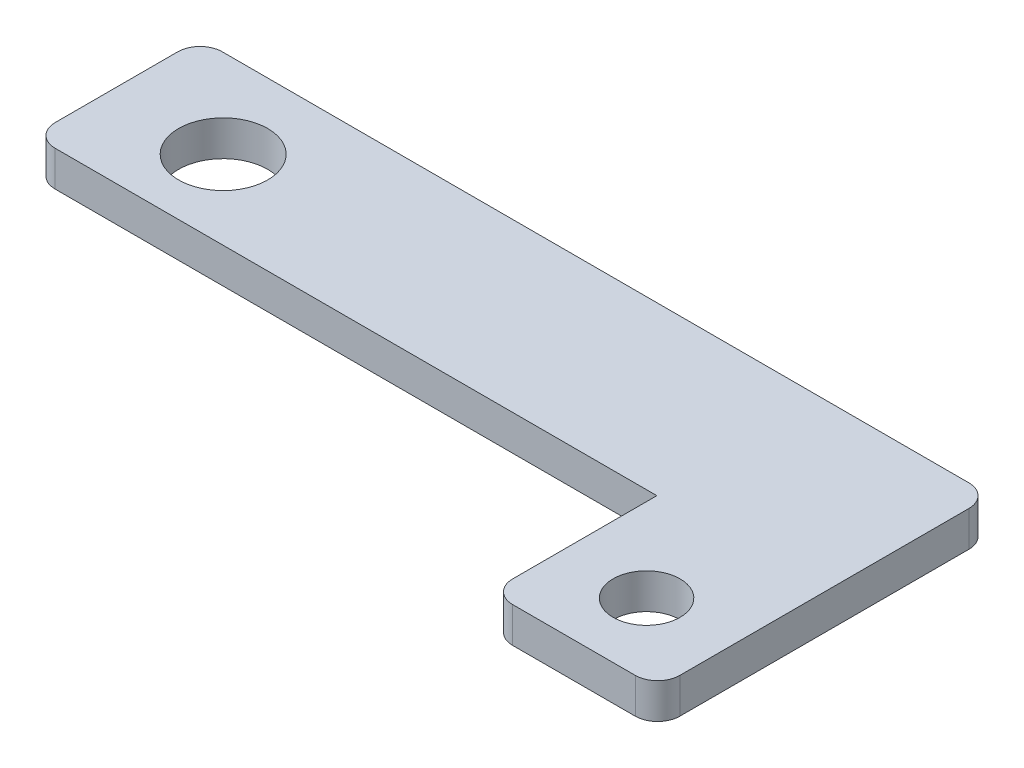
ISO-10303-21;
HEADER;
FILE_DESCRIPTION(('STEP AP214'),'2;1');
FILE_NAME('part.step','',(''),(''),'','','');
FILE_SCHEMA(('AUTOMOTIVE_DESIGN { 1 0 10303 214 1 1 1 1 }'));
ENDSEC;
DATA;
#1=APPLICATION_CONTEXT('core data for automotive mechanical design processes');
#2=APPLICATION_PROTOCOL_DEFINITION('international standard','automotive_design',2000,#1);
#3=PRODUCT_CONTEXT('',#1,'mechanical');
#4=PRODUCT('Part','Part','',(#3));
#5=PRODUCT_RELATED_PRODUCT_CATEGORY('part','',(#4));
#6=PRODUCT_DEFINITION_FORMATION('','',#4);
#7=PRODUCT_DEFINITION_CONTEXT('part definition',#1,'design');
#8=PRODUCT_DEFINITION('design','',#6,#7);
#9=PRODUCT_DEFINITION_SHAPE('','',#8);
#10=(LENGTH_UNIT() NAMED_UNIT(*) SI_UNIT(.MILLI.,.METRE.));
#11=(NAMED_UNIT(*) PLANE_ANGLE_UNIT() SI_UNIT($,.RADIAN.));
#12=(NAMED_UNIT(*) SI_UNIT($,.STERADIAN.) SOLID_ANGLE_UNIT());
#13=UNCERTAINTY_MEASURE_WITH_UNIT(LENGTH_MEASURE(1.E-05),#10,'distance_accuracy_value','');
#14=(GEOMETRIC_REPRESENTATION_CONTEXT(3) GLOBAL_UNCERTAINTY_ASSIGNED_CONTEXT((#13)) GLOBAL_UNIT_ASSIGNED_CONTEXT((#10,
#11,#12)) REPRESENTATION_CONTEXT('',''));
#15=CARTESIAN_POINT('',(0.,0.,0.));
#16=DIRECTION('',(0.,0.,1.));
#17=DIRECTION('',(1.,0.,0.));
#18=AXIS2_PLACEMENT_3D('',#15,#16,#17);
#19=CARTESIAN_POINT('',(0.,44.6697171240975,0.));
#20=DIRECTION('',(0.,-1.,0.));
#21=DIRECTION('',(0.,0.,-1.));
#22=AXIS2_PLACEMENT_3D('',#19,#20,#21);
#23=PLANE('',#22);
#24=CARTESIAN_POINT('',(147.087093798444,44.6697171240975,-59.2577881890432));
#25=DIRECTION('',(0.,-1.,0.));
#26=DIRECTION('',(0.,0.,-1.));
#27=AXIS2_PLACEMENT_3D('',#24,#25,#26);
#28=CIRCLE('',#27,3.99999999999999);
#29=CARTESIAN_POINT('',(147.087093798444,44.6697171240975,-63.2577881890432));
#30=VERTEX_POINT('',#29);
#31=EDGE_CURVE('E170',#30,#30,#28,.T.);
#32=ORIENTED_EDGE('',*,*,#31,.F.);
#33=EDGE_LOOP('',(#32));
#34=FACE_BOUND('',#33,.T.);
#35=DIRECTION('',(-1.,0.,0.));
#36=VECTOR('',#35,1.);
#37=CARTESIAN_POINT('',(208.087093798444,44.6697171240975,-37.2440842596447));
#38=LINE('',#37,#36);
#39=CARTESIAN_POINT('',(206.087093798444,44.6697171240975,-37.2440842596447));
#40=VERTEX_POINT('',#39);
#41=CARTESIAN_POINT('',(195.087093798444,44.6697171240975,-37.2440842596447));
#42=VERTEX_POINT('',#41);
#43=EDGE_CURVE('E139',#40,#42,#38,.T.);
#44=ORIENTED_EDGE('',*,*,#43,.T.);
#45=CARTESIAN_POINT('',(195.087093798444,44.6697171240975,-39.2440842596448));
#46=DIRECTION('',(0.,-1.,0.));
#47=DIRECTION('',(0.,0.,-1.));
#48=AXIS2_PLACEMENT_3D('',#45,#46,#47);
#49=CIRCLE('',#48,2.);
#50=CARTESIAN_POINT('',(193.087093798444,44.6697171240975,-39.2440842596448));
#51=VERTEX_POINT('',#50);
#52=EDGE_CURVE('E134',#42,#51,#49,.T.);
#53=ORIENTED_EDGE('',*,*,#52,.T.);
#54=DIRECTION('',(0.,0.,-1.));
#55=VECTOR('',#54,1.);
#56=CARTESIAN_POINT('',(193.087093798444,44.6697171240975,-52.180672920051));
#57=LINE('',#56,#55);
#58=CARTESIAN_POINT('',(193.087093798444,44.6697171240975,-52.180672920051));
#59=VERTEX_POINT('',#58);
#60=EDGE_CURVE('E126',#51,#59,#57,.T.);
#61=ORIENTED_EDGE('',*,*,#60,.T.);
#62=DIRECTION('',(-1.,0.,0.));
#63=VECTOR('',#62,1.);
#64=CARTESIAN_POINT('',(137.087093798444,44.6697171240975,-52.180672920051));
#65=LINE('',#64,#63);
#66=CARTESIAN_POINT('',(139.087093798444,44.6697171240975,-52.180672920051));
#67=VERTEX_POINT('',#66);
#68=EDGE_CURVE('E131',#59,#67,#65,.T.);
#69=ORIENTED_EDGE('',*,*,#68,.T.);
#70=CARTESIAN_POINT('',(139.087093798444,44.6697171240975,-54.180672920051));
#71=DIRECTION('',(0.,-1.,0.));
#72=DIRECTION('',(0.,0.,-1.));
#73=AXIS2_PLACEMENT_3D('',#70,#71,#72);
#74=CIRCLE('',#73,2.);
#75=CARTESIAN_POINT('',(137.087093798444,44.6697171240975,-54.180672920051));
#76=VERTEX_POINT('',#75);
#77=EDGE_CURVE('E196',#67,#76,#74,.T.);
#78=ORIENTED_EDGE('',*,*,#77,.T.);
#79=DIRECTION('',(0.,0.,-1.));
#80=VECTOR('',#79,1.);
#81=CARTESIAN_POINT('',(137.087093798444,44.6697171240975,-67.180672920051));
#82=LINE('',#81,#80);
#83=CARTESIAN_POINT('',(137.087093798444,44.6697171240975,-65.180672920051));
#84=VERTEX_POINT('',#83);
#85=EDGE_CURVE('E152',#76,#84,#82,.T.);
#86=ORIENTED_EDGE('',*,*,#85,.T.);
#87=CARTESIAN_POINT('',(139.087093798444,44.6697171240975,-65.180672920051));
#88=DIRECTION('',(0.,-1.,0.));
#89=DIRECTION('',(0.,0.,-1.));
#90=AXIS2_PLACEMENT_3D('',#87,#88,#89);
#91=CIRCLE('',#90,2.);
#92=CARTESIAN_POINT('',(139.087093798444,44.6697171240975,-67.180672920051));
#93=VERTEX_POINT('',#92);
#94=EDGE_CURVE('E201',#84,#93,#91,.T.);
#95=ORIENTED_EDGE('',*,*,#94,.T.);
#96=DIRECTION('',(1.,0.,0.));
#97=VECTOR('',#96,1.);
#98=CARTESIAN_POINT('',(137.087093798444,44.6697171240975,-67.180672920051));
#99=LINE('',#98,#97);
#100=CARTESIAN_POINT('',(206.087093798444,44.6697171240975,-67.180672920051));
#101=VERTEX_POINT('',#100);
#102=EDGE_CURVE('E155',#93,#101,#99,.T.);
#103=ORIENTED_EDGE('',*,*,#102,.T.);
#104=CARTESIAN_POINT('',(206.087093798444,44.6697171240975,-65.180672920051));
#105=DIRECTION('',(0.,-1.,0.));
#106=DIRECTION('',(0.,0.,-1.));
#107=AXIS2_PLACEMENT_3D('',#104,#105,#106);
#108=CIRCLE('',#107,2.);
#109=CARTESIAN_POINT('',(208.087093798444,44.6697171240975,-65.180672920051));
#110=VERTEX_POINT('',#109);
#111=EDGE_CURVE('E65',#101,#110,#108,.T.);
#112=ORIENTED_EDGE('',*,*,#111,.T.);
#113=DIRECTION('',(0.,0.,1.));
#114=VECTOR('',#113,1.);
#115=CARTESIAN_POINT('',(208.087093798444,44.6697171240975,-67.180672920051));
#116=LINE('',#115,#114);
#117=CARTESIAN_POINT('',(208.087093798444,44.6697171240975,-39.2440842596447));
#118=VERTEX_POINT('',#117);
#119=EDGE_CURVE('E164',#110,#118,#116,.T.);
#120=ORIENTED_EDGE('',*,*,#119,.T.);
#121=CARTESIAN_POINT('',(206.087093798444,44.6697171240975,-39.2440842596447));
#122=DIRECTION('',(0.,-1.,0.));
#123=DIRECTION('',(0.,0.,-1.));
#124=AXIS2_PLACEMENT_3D('',#121,#122,#123);
#125=CIRCLE('',#124,2.);
#126=EDGE_CURVE('E198',#118,#40,#125,.T.);
#127=ORIENTED_EDGE('',*,*,#126,.T.);
#128=EDGE_LOOP('',(#44,#53,#61,#69,#78,#86,#95,#103,#112,#120,#127));
#129=FACE_BOUND('',#128,.T.);
#130=CARTESIAN_POINT('',(200.587093798444,44.6697171240975,-43.7577881890431));
#131=DIRECTION('',(0.,-1.,0.));
#132=DIRECTION('',(0.,0.,-1.));
#133=AXIS2_PLACEMENT_3D('',#130,#131,#132);
#134=CIRCLE('',#133,2.99999999999999);
#135=CARTESIAN_POINT('',(200.587093798444,44.6697171240975,-46.7577881890431));
#136=VERTEX_POINT('',#135);
#137=EDGE_CURVE('E294',#136,#136,#134,.T.);
#138=ORIENTED_EDGE('',*,*,#137,.F.);
#139=EDGE_LOOP('',(#138));
#140=FACE_BOUND('',#139,.T.);
#141=ADVANCED_FACE('F43',(#34,#129,#140),#23,.T.);
#142=CARTESIAN_POINT('',(0.,47.8447171240974,0.));
#143=DIRECTION('',(0.,-1.,0.));
#144=DIRECTION('',(0.,0.,-1.));
#145=AXIS2_PLACEMENT_3D('',#142,#143,#144);
#146=PLANE('',#145);
#147=DIRECTION('',(0.,0.,-1.));
#148=VECTOR('',#147,1.);
#149=CARTESIAN_POINT('',(193.087093798444,47.8447171240974,-52.180672920051));
#150=LINE('',#149,#148);
#151=CARTESIAN_POINT('',(193.087093798444,47.8447171240974,-39.2440842596448));
#152=VERTEX_POINT('',#151);
#153=CARTESIAN_POINT('',(193.087093798444,47.8447171240974,-52.180672920051));
#154=VERTEX_POINT('',#153);
#155=EDGE_CURVE('E144',#152,#154,#150,.T.);
#156=ORIENTED_EDGE('',*,*,#155,.F.);
#157=CARTESIAN_POINT('',(195.087093798444,47.8447171240974,-39.2440842596448));
#158=DIRECTION('',(0.,-1.,0.));
#159=DIRECTION('',(0.,0.,-1.));
#160=AXIS2_PLACEMENT_3D('',#157,#158,#159);
#161=CIRCLE('',#160,2.);
#162=CARTESIAN_POINT('',(195.087093798444,47.8447171240974,-37.2440842596447));
#163=VERTEX_POINT('',#162);
#164=EDGE_CURVE('E189',#152,#163,#161,.F.);
#165=ORIENTED_EDGE('',*,*,#164,.T.);
#166=DIRECTION('',(-1.,0.,0.));
#167=VECTOR('',#166,1.);
#168=CARTESIAN_POINT('',(208.087093798444,47.8447171240974,-37.2440842596447));
#169=LINE('',#168,#167);
#170=CARTESIAN_POINT('',(206.087093798444,47.8447171240974,-37.2440842596447));
#171=VERTEX_POINT('',#170);
#172=EDGE_CURVE('E157',#171,#163,#169,.T.);
#173=ORIENTED_EDGE('',*,*,#172,.F.);
#174=CARTESIAN_POINT('',(206.087093798444,47.8447171240974,-39.2440842596447));
#175=DIRECTION('',(0.,-1.,0.));
#176=DIRECTION('',(0.,0.,-1.));
#177=AXIS2_PLACEMENT_3D('',#174,#175,#176);
#178=CIRCLE('',#177,2.);
#179=CARTESIAN_POINT('',(208.087093798444,47.8447171240974,-39.2440842596447));
#180=VERTEX_POINT('',#179);
#181=EDGE_CURVE('E183',#171,#180,#178,.F.);
#182=ORIENTED_EDGE('',*,*,#181,.T.);
#183=DIRECTION('',(0.,0.,1.));
#184=VECTOR('',#183,1.);
#185=CARTESIAN_POINT('',(208.087093798444,47.8447171240974,-67.180672920051));
#186=LINE('',#185,#184);
#187=CARTESIAN_POINT('',(208.087093798444,47.8447171240974,-65.180672920051));
#188=VERTEX_POINT('',#187);
#189=EDGE_CURVE('E176',#188,#180,#186,.T.);
#190=ORIENTED_EDGE('',*,*,#189,.F.);
#191=CARTESIAN_POINT('',(206.087093798444,47.8447171240974,-65.180672920051));
#192=DIRECTION('',(0.,-1.,0.));
#193=DIRECTION('',(0.,0.,-1.));
#194=AXIS2_PLACEMENT_3D('',#191,#192,#193);
#195=CIRCLE('',#194,2.);
#196=CARTESIAN_POINT('',(206.087093798444,47.8447171240974,-67.180672920051));
#197=VERTEX_POINT('',#196);
#198=EDGE_CURVE('E185',#188,#197,#195,.F.);
#199=ORIENTED_EDGE('',*,*,#198,.T.);
#200=DIRECTION('',(1.,0.,0.));
#201=VECTOR('',#200,1.);
#202=CARTESIAN_POINT('',(137.087093798444,47.8447171240974,-67.180672920051));
#203=LINE('',#202,#201);
#204=CARTESIAN_POINT('',(139.087093798444,47.8447171240974,-67.180672920051));
#205=VERTEX_POINT('',#204);
#206=EDGE_CURVE('E173',#205,#197,#203,.T.);
#207=ORIENTED_EDGE('',*,*,#206,.F.);
#208=CARTESIAN_POINT('',(139.087093798444,47.8447171240974,-65.180672920051));
#209=DIRECTION('',(0.,-1.,0.));
#210=DIRECTION('',(0.,0.,-1.));
#211=AXIS2_PLACEMENT_3D('',#208,#209,#210);
#212=CIRCLE('',#211,2.);
#213=CARTESIAN_POINT('',(137.087093798444,47.8447171240974,-65.180672920051));
#214=VERTEX_POINT('',#213);
#215=EDGE_CURVE('E187',#205,#214,#212,.F.);
#216=ORIENTED_EDGE('',*,*,#215,.T.);
#217=DIRECTION('',(0.,0.,-1.));
#218=VECTOR('',#217,1.);
#219=CARTESIAN_POINT('',(137.087093798444,47.8447171240974,-67.180672920051));
#220=LINE('',#219,#218);
#221=CARTESIAN_POINT('',(137.087093798444,47.8447171240974,-54.180672920051));
#222=VERTEX_POINT('',#221);
#223=EDGE_CURVE('E169',#222,#214,#220,.T.);
#224=ORIENTED_EDGE('',*,*,#223,.F.);
#225=CARTESIAN_POINT('',(139.087093798444,47.8447171240974,-54.180672920051));
#226=DIRECTION('',(0.,-1.,0.));
#227=DIRECTION('',(0.,0.,-1.));
#228=AXIS2_PLACEMENT_3D('',#225,#226,#227);
#229=CIRCLE('',#228,2.);
#230=CARTESIAN_POINT('',(139.087093798444,47.8447171240974,-52.180672920051));
#231=VERTEX_POINT('',#230);
#232=EDGE_CURVE('E181',#222,#231,#229,.F.);
#233=ORIENTED_EDGE('',*,*,#232,.T.);
#234=DIRECTION('',(-1.,0.,0.));
#235=VECTOR('',#234,1.);
#236=CARTESIAN_POINT('',(137.087093798444,47.8447171240974,-52.180672920051));
#237=LINE('',#236,#235);
#238=EDGE_CURVE('E167',#154,#231,#237,.T.);
#239=ORIENTED_EDGE('',*,*,#238,.F.);
#240=EDGE_LOOP('',(#156,#165,#173,#182,#190,#199,#207,#216,#224,#233,#239));
#241=FACE_BOUND('',#240,.T.);
#242=CARTESIAN_POINT('',(147.087093798444,47.8447171240974,-59.2577881890432));
#243=DIRECTION('',(0.,-1.,0.));
#244=DIRECTION('',(0.,0.,-1.));
#245=AXIS2_PLACEMENT_3D('',#242,#243,#244);
#246=CIRCLE('',#245,3.99999999999999);
#247=CARTESIAN_POINT('',(147.087093798444,47.8447171240974,-63.2577881890432));
#248=VERTEX_POINT('',#247);
#249=EDGE_CURVE('E160',#248,#248,#246,.T.);
#250=ORIENTED_EDGE('',*,*,#249,.T.);
#251=EDGE_LOOP('',(#250));
#252=FACE_BOUND('',#251,.T.);
#253=CARTESIAN_POINT('',(200.587093798444,47.8447171240974,-43.7577881890431));
#254=DIRECTION('',(0.,-1.,0.));
#255=DIRECTION('',(0.,0.,-1.));
#256=AXIS2_PLACEMENT_3D('',#253,#254,#255);
#257=CIRCLE('',#256,2.99999999999999);
#258=CARTESIAN_POINT('',(200.587093798444,47.8447171240974,-46.7577881890431));
#259=VERTEX_POINT('',#258);
#260=EDGE_CURVE('E297',#259,#259,#257,.T.);
#261=ORIENTED_EDGE('',*,*,#260,.T.);
#262=EDGE_LOOP('',(#261));
#263=FACE_BOUND('',#262,.T.);
#264=ADVANCED_FACE('F220',(#241,#252,#263),#146,.F.);
#265=CARTESIAN_POINT('',(137.087093798444,44.6697171240975,-52.180672920051));
#266=DIRECTION('',(0.,0.,-1.));
#267=DIRECTION('',(-1.,0.,0.));
#268=AXIS2_PLACEMENT_3D('',#265,#266,#267);
#269=PLANE('',#268);
#270=ORIENTED_EDGE('',*,*,#238,.T.);
#271=DIRECTION('',(0.,1.,0.));
#272=VECTOR('',#271,1.);
#273=CARTESIAN_POINT('',(139.087093798444,44.6697171240975,-52.180672920051));
#274=LINE('',#273,#272);
#275=EDGE_CURVE('E11',#231,#67,#274,.F.);
#276=ORIENTED_EDGE('',*,*,#275,.T.);
#277=ORIENTED_EDGE('',*,*,#68,.F.);
#278=DIRECTION('',(0.,1.,0.));
#279=VECTOR('',#278,1.);
#280=CARTESIAN_POINT('',(193.087093798444,44.6697171240975,-52.180672920051));
#281=LINE('',#280,#279);
#282=EDGE_CURVE('E138',#59,#154,#281,.T.);
#283=ORIENTED_EDGE('',*,*,#282,.T.);
#284=EDGE_LOOP('',(#270,#276,#277,#283));
#285=FACE_BOUND('',#284,.T.);
#286=ADVANCED_FACE('F150',(#285),#269,.F.);
#287=CARTESIAN_POINT('',(137.087093798444,44.6697171240975,-67.180672920051));
#288=DIRECTION('',(1.,0.,0.));
#289=DIRECTION('',(0.,0.,-1.));
#290=AXIS2_PLACEMENT_3D('',#287,#288,#289);
#291=PLANE('',#290);
#292=ORIENTED_EDGE('',*,*,#223,.T.);
#293=DIRECTION('',(0.,1.,0.));
#294=VECTOR('',#293,1.);
#295=CARTESIAN_POINT('',(137.087093798444,44.6697171240975,-65.180672920051));
#296=LINE('',#295,#294);
#297=EDGE_CURVE('E212',#214,#84,#296,.F.);
#298=ORIENTED_EDGE('',*,*,#297,.T.);
#299=ORIENTED_EDGE('',*,*,#85,.F.);
#300=DIRECTION('',(0.,1.,0.));
#301=VECTOR('',#300,1.);
#302=CARTESIAN_POINT('',(137.087093798444,44.6697171240975,-54.180672920051));
#303=LINE('',#302,#301);
#304=EDGE_CURVE('E209',#76,#222,#303,.T.);
#305=ORIENTED_EDGE('',*,*,#304,.T.);
#306=EDGE_LOOP('',(#292,#298,#299,#305));
#307=FACE_BOUND('',#306,.T.);
#308=ADVANCED_FACE('F240',(#307),#291,.F.);
#309=CARTESIAN_POINT('',(137.087093798444,44.6697171240975,-67.180672920051));
#310=DIRECTION('',(0.,0.,1.));
#311=DIRECTION('',(1.,0.,0.));
#312=AXIS2_PLACEMENT_3D('',#309,#310,#311);
#313=PLANE('',#312);
#314=ORIENTED_EDGE('',*,*,#102,.F.);
#315=DIRECTION('',(0.,1.,0.));
#316=VECTOR('',#315,1.);
#317=CARTESIAN_POINT('',(139.087093798444,44.6697171240975,-67.180672920051));
#318=LINE('',#317,#316);
#319=EDGE_CURVE('E206',#93,#205,#318,.T.);
#320=ORIENTED_EDGE('',*,*,#319,.T.);
#321=ORIENTED_EDGE('',*,*,#206,.T.);
#322=DIRECTION('',(0.,1.,0.));
#323=VECTOR('',#322,1.);
#324=CARTESIAN_POINT('',(206.087093798444,44.6697171240975,-67.180672920051));
#325=LINE('',#324,#323);
#326=EDGE_CURVE('E204',#197,#101,#325,.F.);
#327=ORIENTED_EDGE('',*,*,#326,.T.);
#328=EDGE_LOOP('',(#314,#320,#321,#327));
#329=FACE_BOUND('',#328,.T.);
#330=ADVANCED_FACE('F247',(#329),#313,.F.);
#331=CARTESIAN_POINT('',(208.087093798444,44.6697171240975,-67.180672920051));
#332=DIRECTION('',(-1.,0.,0.));
#333=DIRECTION('',(0.,0.,1.));
#334=AXIS2_PLACEMENT_3D('',#331,#332,#333);
#335=PLANE('',#334);
#336=ORIENTED_EDGE('',*,*,#119,.F.);
#337=DIRECTION('',(0.,1.,0.));
#338=VECTOR('',#337,1.);
#339=CARTESIAN_POINT('',(208.087093798444,44.6697171240975,-65.180672920051));
#340=LINE('',#339,#338);
#341=EDGE_CURVE('E51',#110,#188,#340,.T.);
#342=ORIENTED_EDGE('',*,*,#341,.T.);
#343=ORIENTED_EDGE('',*,*,#189,.T.);
#344=DIRECTION('',(0.,1.,0.));
#345=VECTOR('',#344,1.);
#346=CARTESIAN_POINT('',(208.087093798444,44.6697171240975,-39.2440842596447));
#347=LINE('',#346,#345);
#348=EDGE_CURVE('E58',#180,#118,#347,.F.);
#349=ORIENTED_EDGE('',*,*,#348,.T.);
#350=EDGE_LOOP('',(#336,#342,#343,#349));
#351=FACE_BOUND('',#350,.T.);
#352=ADVANCED_FACE('F217',(#351),#335,.F.);
#353=CARTESIAN_POINT('',(208.087093798444,44.6697171240975,-37.2440842596447));
#354=DIRECTION('',(0.,0.,-1.));
#355=DIRECTION('',(-1.,0.,0.));
#356=AXIS2_PLACEMENT_3D('',#353,#354,#355);
#357=PLANE('',#356);
#358=ORIENTED_EDGE('',*,*,#172,.T.);
#359=DIRECTION('',(0.,1.,0.));
#360=VECTOR('',#359,1.);
#361=CARTESIAN_POINT('',(195.087093798444,44.6697171240975,-37.2440842596447));
#362=LINE('',#361,#360);
#363=EDGE_CURVE('E194',#163,#42,#362,.F.);
#364=ORIENTED_EDGE('',*,*,#363,.T.);
#365=ORIENTED_EDGE('',*,*,#43,.F.);
#366=DIRECTION('',(0.,1.,0.));
#367=VECTOR('',#366,1.);
#368=CARTESIAN_POINT('',(206.087093798444,44.6697171240975,-37.2440842596447));
#369=LINE('',#368,#367);
#370=EDGE_CURVE('E191',#40,#171,#369,.T.);
#371=ORIENTED_EDGE('',*,*,#370,.T.);
#372=EDGE_LOOP('',(#358,#364,#365,#371));
#373=FACE_BOUND('',#372,.T.);
#374=ADVANCED_FACE('F230',(#373),#357,.F.);
#375=CARTESIAN_POINT('',(193.087093798444,44.6697171240975,-52.180672920051));
#376=DIRECTION('',(1.,0.,0.));
#377=DIRECTION('',(0.,0.,-1.));
#378=AXIS2_PLACEMENT_3D('',#375,#376,#377);
#379=PLANE('',#378);
#380=ORIENTED_EDGE('',*,*,#60,.F.);
#381=DIRECTION('',(0.,1.,0.));
#382=VECTOR('',#381,1.);
#383=CARTESIAN_POINT('',(193.087093798444,44.6697171240975,-39.2440842596448));
#384=LINE('',#383,#382);
#385=EDGE_CURVE('E148',#51,#152,#384,.T.);
#386=ORIENTED_EDGE('',*,*,#385,.T.);
#387=ORIENTED_EDGE('',*,*,#155,.T.);
#388=ORIENTED_EDGE('',*,*,#282,.F.);
#389=EDGE_LOOP('',(#380,#386,#387,#388));
#390=FACE_BOUND('',#389,.T.);
#391=ADVANCED_FACE('F142',(#390),#379,.F.);
#392=CARTESIAN_POINT('',(147.087093798444,44.6697171240975,-59.2577881890432));
#393=DIRECTION('',(0.,1.,0.));
#394=DIRECTION('',(0.,0.,1.));
#395=AXIS2_PLACEMENT_3D('',#392,#393,#394);
#396=CYLINDRICAL_SURFACE('',#395,3.99999999999999);
#397=ORIENTED_EDGE('',*,*,#31,.T.);
#398=EDGE_LOOP('',(#397));
#399=FACE_BOUND('',#398,.T.);
#400=ORIENTED_EDGE('',*,*,#249,.F.);
#401=EDGE_LOOP('',(#400));
#402=FACE_BOUND('',#401,.T.);
#403=ADVANCED_FACE('F267',(#399,#402),#396,.F.);
#404=CARTESIAN_POINT('',(200.587093798444,44.6697171240975,-43.7577881890431));
#405=DIRECTION('',(0.,1.,0.));
#406=DIRECTION('',(0.,0.,1.));
#407=AXIS2_PLACEMENT_3D('',#404,#405,#406);
#408=CYLINDRICAL_SURFACE('',#407,2.99999999999999);
#409=ORIENTED_EDGE('',*,*,#137,.T.);
#410=EDGE_LOOP('',(#409));
#411=FACE_BOUND('',#410,.T.);
#412=ORIENTED_EDGE('',*,*,#260,.F.);
#413=EDGE_LOOP('',(#412));
#414=FACE_BOUND('',#413,.T.);
#415=ADVANCED_FACE('F283',(#411,#414),#408,.F.);
#416=CARTESIAN_POINT('',(195.087093798444,44.6697171240975,-39.2440842596448));
#417=DIRECTION('',(0.,1.,0.));
#418=DIRECTION('',(0.,0.,1.));
#419=AXIS2_PLACEMENT_3D('',#416,#417,#418);
#420=CYLINDRICAL_SURFACE('',#419,2.);
#421=ORIENTED_EDGE('',*,*,#52,.F.);
#422=ORIENTED_EDGE('',*,*,#363,.F.);
#423=ORIENTED_EDGE('',*,*,#164,.F.);
#424=ORIENTED_EDGE('',*,*,#385,.F.);
#425=EDGE_LOOP('',(#421,#422,#423,#424));
#426=FACE_BOUND('',#425,.T.);
#427=ADVANCED_FACE('F233',(#426),#420,.T.);
#428=CARTESIAN_POINT('',(139.087093798444,44.6697171240975,-65.180672920051));
#429=DIRECTION('',(0.,1.,0.));
#430=DIRECTION('',(0.,0.,1.));
#431=AXIS2_PLACEMENT_3D('',#428,#429,#430);
#432=CYLINDRICAL_SURFACE('',#431,2.);
#433=ORIENTED_EDGE('',*,*,#94,.F.);
#434=ORIENTED_EDGE('',*,*,#297,.F.);
#435=ORIENTED_EDGE('',*,*,#215,.F.);
#436=ORIENTED_EDGE('',*,*,#319,.F.);
#437=EDGE_LOOP('',(#433,#434,#435,#436));
#438=FACE_BOUND('',#437,.T.);
#439=ADVANCED_FACE('F243',(#438),#432,.T.);
#440=CARTESIAN_POINT('',(206.087093798444,44.6697171240975,-65.180672920051));
#441=DIRECTION('',(0.,1.,0.));
#442=DIRECTION('',(0.,0.,1.));
#443=AXIS2_PLACEMENT_3D('',#440,#441,#442);
#444=CYLINDRICAL_SURFACE('',#443,2.);
#445=ORIENTED_EDGE('',*,*,#111,.F.);
#446=ORIENTED_EDGE('',*,*,#326,.F.);
#447=ORIENTED_EDGE('',*,*,#198,.F.);
#448=ORIENTED_EDGE('',*,*,#341,.F.);
#449=EDGE_LOOP('',(#445,#446,#447,#448));
#450=FACE_BOUND('',#449,.T.);
#451=ADVANCED_FACE('F249',(#450),#444,.T.);
#452=CARTESIAN_POINT('',(206.087093798444,44.6697171240975,-39.2440842596447));
#453=DIRECTION('',(0.,1.,0.));
#454=DIRECTION('',(0.,0.,1.));
#455=AXIS2_PLACEMENT_3D('',#452,#453,#454);
#456=CYLINDRICAL_SURFACE('',#455,2.);
#457=ORIENTED_EDGE('',*,*,#126,.F.);
#458=ORIENTED_EDGE('',*,*,#348,.F.);
#459=ORIENTED_EDGE('',*,*,#181,.F.);
#460=ORIENTED_EDGE('',*,*,#370,.F.);
#461=EDGE_LOOP('',(#457,#458,#459,#460));
#462=FACE_BOUND('',#461,.T.);
#463=ADVANCED_FACE('F227',(#462),#456,.T.);
#464=CARTESIAN_POINT('',(139.087093798444,44.6697171240975,-54.180672920051));
#465=DIRECTION('',(0.,1.,0.));
#466=DIRECTION('',(0.,0.,1.));
#467=AXIS2_PLACEMENT_3D('',#464,#465,#466);
#468=CYLINDRICAL_SURFACE('',#467,2.);
#469=ORIENTED_EDGE('',*,*,#77,.F.);
#470=ORIENTED_EDGE('',*,*,#275,.F.);
#471=ORIENTED_EDGE('',*,*,#232,.F.);
#472=ORIENTED_EDGE('',*,*,#304,.F.);
#473=EDGE_LOOP('',(#469,#470,#471,#472));
#474=FACE_BOUND('',#473,.T.);
#475=ADVANCED_FACE('F45',(#474),#468,.T.);
#476=CLOSED_SHELL('',(#141,#264,#286,#308,#330,#352,#374,#391,#403,#415,#427,#439,#451,#463,#475));
#477=MANIFOLD_SOLID_BREP('B2',#476);
#478=ADVANCED_BREP_SHAPE_REPRESENTATION('',(#18,#477),#14);
#479=SHAPE_DEFINITION_REPRESENTATION(#9,#478);
ENDSEC;
END-ISO-10303-21;
